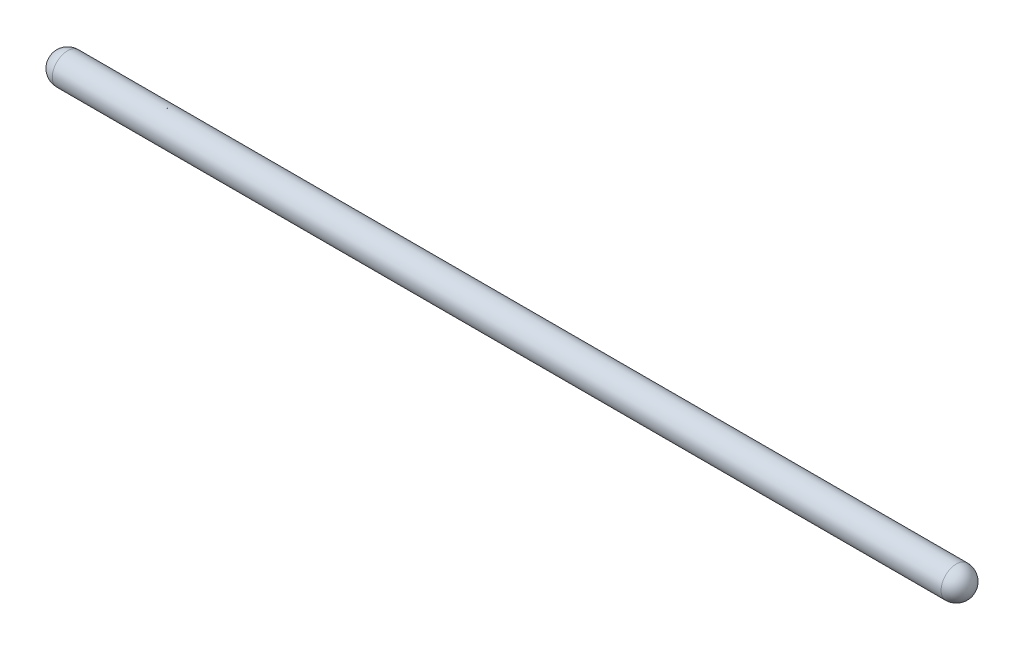
ISO-10303-21;
HEADER;
FILE_DESCRIPTION(('STEP AP214'),'2;1');
FILE_NAME('part.step','',(''),(''),'','','');
FILE_SCHEMA(('AUTOMOTIVE_DESIGN { 1 0 10303 214 1 1 1 1 }'));
ENDSEC;
DATA;
#1=APPLICATION_CONTEXT('core data for automotive mechanical design processes');
#2=APPLICATION_PROTOCOL_DEFINITION('international standard','automotive_design',2000,#1);
#3=PRODUCT_CONTEXT('',#1,'mechanical');
#4=PRODUCT('Part','Part','',(#3));
#5=PRODUCT_RELATED_PRODUCT_CATEGORY('part','',(#4));
#6=PRODUCT_DEFINITION_FORMATION('','',#4);
#7=PRODUCT_DEFINITION_CONTEXT('part definition',#1,'design');
#8=PRODUCT_DEFINITION('design','',#6,#7);
#9=PRODUCT_DEFINITION_SHAPE('','',#8);
#10=(LENGTH_UNIT() NAMED_UNIT(*) SI_UNIT(.MILLI.,.METRE.));
#11=(NAMED_UNIT(*) PLANE_ANGLE_UNIT() SI_UNIT($,.RADIAN.));
#12=(NAMED_UNIT(*) SI_UNIT($,.STERADIAN.) SOLID_ANGLE_UNIT());
#13=UNCERTAINTY_MEASURE_WITH_UNIT(LENGTH_MEASURE(1.E-05),#10,'distance_accuracy_value','');
#14=(GEOMETRIC_REPRESENTATION_CONTEXT(3) GLOBAL_UNCERTAINTY_ASSIGNED_CONTEXT((#13)) GLOBAL_UNIT_ASSIGNED_CONTEXT((#10,
#11,#12)) REPRESENTATION_CONTEXT('',''));
#15=CARTESIAN_POINT('',(0.,0.,0.));
#16=DIRECTION('',(0.,0.,1.));
#17=DIRECTION('',(1.,0.,0.));
#18=AXIS2_PLACEMENT_3D('',#15,#16,#17);
#19=CARTESIAN_POINT('',(2.5,0.,0.));
#20=DIRECTION('',(-1.,0.,0.));
#21=DIRECTION('',(0.,0.999999999985917,-5.30717958668678E-06));
#22=AXIS2_PLACEMENT_3D('',#19,#20,#21);
#23=SPHERICAL_SURFACE('',#22,2.5);
#24=CARTESIAN_POINT('',(2.5,0.,0.));
#25=DIRECTION('',(0.,0.,1.));
#26=DIRECTION('',(1.,0.,0.));
#27=AXIS2_PLACEMENT_3D('',#24,#25,#26);
#28=CIRCLE('',#27,2.5);
#29=CARTESIAN_POINT('',(2.5,2.5,0.));
#30=VERTEX_POINT('',#29);
#31=CARTESIAN_POINT('',(0.,0.,0.));
#32=VERTEX_POINT('',#31);
#33=EDGE_CURVE('E83',#30,#32,#28,.T.);
#34=ORIENTED_EDGE('',*,*,#33,.T.);
#35=CARTESIAN_POINT('',(2.5,0.,0.));
#36=DIRECTION('',(0.,5.30717958668678E-06,0.999999999985917));
#37=DIRECTION('',(1.,0.,0.));
#38=AXIS2_PLACEMENT_3D('',#35,#36,#37);
#39=CIRCLE('',#38,2.5);
#40=CARTESIAN_POINT('',(2.5,2.49999999996479,-1.32679489667169E-05));
#41=VERTEX_POINT('',#40);
#42=EDGE_CURVE('E86',#41,#32,#39,.T.);
#43=ORIENTED_EDGE('',*,*,#42,.F.);
#44=CARTESIAN_POINT('',(2.5,0.,0.));
#45=DIRECTION('',(-1.,0.,0.));
#46=DIRECTION('',(0.,0.,1.));
#47=AXIS2_PLACEMENT_3D('',#44,#45,#46);
#48=CIRCLE('',#47,2.5);
#49=EDGE_CURVE('E47',#41,#30,#48,.T.);
#50=ORIENTED_EDGE('',*,*,#49,.T.);
#51=EDGE_LOOP('',(#34,#43,#50));
#52=FACE_BOUND('',#51,.T.);
#53=ADVANCED_FACE('F41',(#52),#23,.T.);
#54=CARTESIAN_POINT('',(147.5,0.,0.));
#55=DIRECTION('',(-1.,0.,0.));
#56=DIRECTION('',(0.,0.999999999985917,-5.30717958668678E-06));
#57=AXIS2_PLACEMENT_3D('',#54,#55,#56);
#58=SPHERICAL_SURFACE('',#57,2.5);
#59=CARTESIAN_POINT('',(147.5,0.,0.));
#60=DIRECTION('',(-1.,0.,0.));
#61=DIRECTION('',(0.,0.,1.));
#62=AXIS2_PLACEMENT_3D('',#59,#60,#61);
#63=CIRCLE('',#62,2.5);
#64=CARTESIAN_POINT('',(147.5,2.49999999996479,-1.32679489667169E-05));
#65=VERTEX_POINT('',#64);
#66=CARTESIAN_POINT('',(147.5,2.5,0.));
#67=VERTEX_POINT('',#66);
#68=EDGE_CURVE('E11',#65,#67,#63,.T.);
#69=ORIENTED_EDGE('',*,*,#68,.F.);
#70=CARTESIAN_POINT('',(147.5,0.,0.));
#71=DIRECTION('',(0.,5.30717958668678E-06,0.999999999985917));
#72=DIRECTION('',(1.,0.,0.));
#73=AXIS2_PLACEMENT_3D('',#70,#71,#72);
#74=CIRCLE('',#73,2.5);
#75=CARTESIAN_POINT('',(150.,0.,0.));
#76=VERTEX_POINT('',#75);
#77=EDGE_CURVE('E76',#76,#65,#74,.T.);
#78=ORIENTED_EDGE('',*,*,#77,.F.);
#79=CARTESIAN_POINT('',(147.5,0.,0.));
#80=DIRECTION('',(0.,0.,1.));
#81=DIRECTION('',(1.,0.,0.));
#82=AXIS2_PLACEMENT_3D('',#79,#80,#81);
#83=CIRCLE('',#82,2.5);
#84=EDGE_CURVE('E77',#76,#67,#83,.T.);
#85=ORIENTED_EDGE('',*,*,#84,.T.);
#86=EDGE_LOOP('',(#69,#78,#85));
#87=FACE_BOUND('',#86,.T.);
#88=ADVANCED_FACE('F43',(#87),#58,.T.);
#89=CARTESIAN_POINT('',(0.,0.,0.));
#90=DIRECTION('',(-1.,0.,0.));
#91=DIRECTION('',(0.,0.,1.));
#92=AXIS2_PLACEMENT_3D('',#89,#90,#91);
#93=CYLINDRICAL_SURFACE('',#92,2.5);
#94=DIRECTION('',(-1.,0.,0.));
#95=VECTOR('',#94,1.);
#96=CARTESIAN_POINT('',(2.5,2.49999999996479,-1.32679489667169E-05));
#97=LINE('',#96,#95);
#98=EDGE_CURVE('E78',#65,#41,#97,.T.);
#99=ORIENTED_EDGE('',*,*,#98,.F.);
#100=ORIENTED_EDGE('',*,*,#68,.T.);
#101=DIRECTION('',(-1.,0.,0.));
#102=VECTOR('',#101,1.);
#103=CARTESIAN_POINT('',(2.5,2.5,0.));
#104=LINE('',#103,#102);
#105=EDGE_CURVE('E71',#67,#30,#104,.T.);
#106=ORIENTED_EDGE('',*,*,#105,.T.);
#107=ORIENTED_EDGE('',*,*,#49,.F.);
#108=EDGE_LOOP('',(#99,#100,#106,#107));
#109=FACE_BOUND('',#108,.T.);
#110=ADVANCED_FACE('F74',(#109),#93,.T.);
#111=CARTESIAN_POINT('',(2.5,0.,0.));
#112=DIRECTION('',(0.,5.30717958668678E-06,0.999999999985917));
#113=DIRECTION('',(1.,0.,0.));
#114=AXIS2_PLACEMENT_3D('',#111,#112,#113);
#115=PLANE('',#114);
#116=ORIENTED_EDGE('',*,*,#42,.T.);
#117=DIRECTION('',(1.,0.,0.));
#118=VECTOR('',#117,1.);
#119=CARTESIAN_POINT('',(150.,0.,0.));
#120=LINE('',#119,#118);
#121=EDGE_CURVE('E87',#32,#76,#120,.T.);
#122=ORIENTED_EDGE('',*,*,#121,.T.);
#123=ORIENTED_EDGE('',*,*,#77,.T.);
#124=ORIENTED_EDGE('',*,*,#98,.T.);
#125=EDGE_LOOP('',(#116,#122,#123,#124));
#126=FACE_BOUND('',#125,.T.);
#127=ADVANCED_FACE('F100',(#126),#115,.T.);
#128=CARTESIAN_POINT('',(2.5,0.,0.));
#129=DIRECTION('',(0.,0.,1.));
#130=DIRECTION('',(1.,0.,0.));
#131=AXIS2_PLACEMENT_3D('',#128,#129,#130);
#132=PLANE('',#131);
#133=ORIENTED_EDGE('',*,*,#33,.F.);
#134=ORIENTED_EDGE('',*,*,#105,.F.);
#135=ORIENTED_EDGE('',*,*,#84,.F.);
#136=ORIENTED_EDGE('',*,*,#121,.F.);
#137=EDGE_LOOP('',(#133,#134,#135,#136));
#138=FACE_BOUND('',#137,.T.);
#139=ADVANCED_FACE('F84',(#138),#132,.F.);
#140=CLOSED_SHELL('',(#53,#88,#110,#127,#139));
#141=MANIFOLD_SOLID_BREP('B2',#140);
#142=ADVANCED_BREP_SHAPE_REPRESENTATION('',(#18,#141),#14);
#143=SHAPE_DEFINITION_REPRESENTATION(#9,#142);
ENDSEC;
END-ISO-10303-21;
